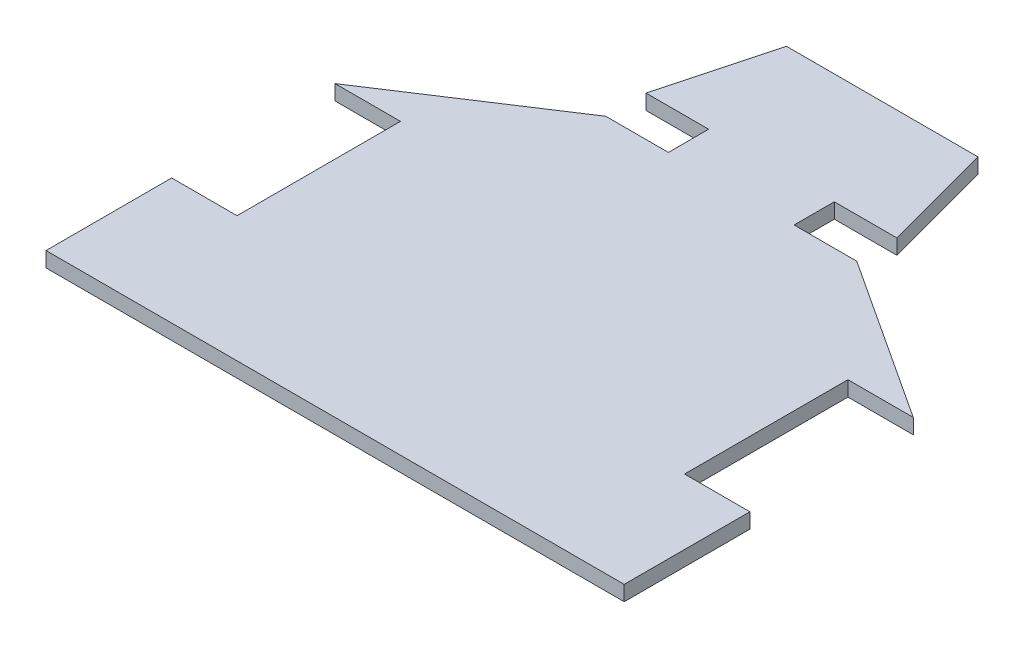
ISO-10303-21;
HEADER;
FILE_DESCRIPTION(('STEP AP214'),'2;1');
FILE_NAME('part.step','',(''),(''),'','','');
FILE_SCHEMA(('AUTOMOTIVE_DESIGN { 1 0 10303 214 1 1 1 1 }'));
ENDSEC;
DATA;
#1=APPLICATION_CONTEXT('core data for automotive mechanical design processes');
#2=APPLICATION_PROTOCOL_DEFINITION('international standard','automotive_design',2000,#1);
#3=PRODUCT_CONTEXT('',#1,'mechanical');
#4=PRODUCT('Part','Part','',(#3));
#5=PRODUCT_RELATED_PRODUCT_CATEGORY('part','',(#4));
#6=PRODUCT_DEFINITION_FORMATION('','',#4);
#7=PRODUCT_DEFINITION_CONTEXT('part definition',#1,'design');
#8=PRODUCT_DEFINITION('design','',#6,#7);
#9=PRODUCT_DEFINITION_SHAPE('','',#8);
#10=(LENGTH_UNIT() NAMED_UNIT(*) SI_UNIT(.MILLI.,.METRE.));
#11=(NAMED_UNIT(*) PLANE_ANGLE_UNIT() SI_UNIT($,.RADIAN.));
#12=(NAMED_UNIT(*) SI_UNIT($,.STERADIAN.) SOLID_ANGLE_UNIT());
#13=UNCERTAINTY_MEASURE_WITH_UNIT(LENGTH_MEASURE(1.E-05),#10,'distance_accuracy_value','');
#14=(GEOMETRIC_REPRESENTATION_CONTEXT(3) GLOBAL_UNCERTAINTY_ASSIGNED_CONTEXT((#13)) GLOBAL_UNIT_ASSIGNED_CONTEXT((#10,
#11,#12)) REPRESENTATION_CONTEXT('',''));
#15=CARTESIAN_POINT('',(0.,0.,0.));
#16=DIRECTION('',(0.,0.,1.));
#17=DIRECTION('',(1.,0.,0.));
#18=AXIS2_PLACEMENT_3D('',#15,#16,#17);
#19=CARTESIAN_POINT('',(-115.,6.,0.));
#20=DIRECTION('',(1.,0.,0.));
#21=DIRECTION('',(0.,0.,-1.));
#22=AXIS2_PLACEMENT_3D('',#19,#20,#21);
#23=PLANE('',#22);
#24=DIRECTION('',(0.,0.,1.));
#25=VECTOR('',#24,1.);
#26=CARTESIAN_POINT('',(-115.,0.,0.));
#27=LINE('',#26,#25);
#28=CARTESIAN_POINT('',(-115.,0.,-50.));
#29=VERTEX_POINT('',#28);
#30=CARTESIAN_POINT('',(-115.,0.,0.));
#31=VERTEX_POINT('',#30);
#32=EDGE_CURVE('E204',#29,#31,#27,.T.);
#33=ORIENTED_EDGE('',*,*,#32,.T.);
#34=DIRECTION('',(0.,-1.,0.));
#35=VECTOR('',#34,1.);
#36=CARTESIAN_POINT('',(-115.,6.,0.));
#37=LINE('',#36,#35);
#38=CARTESIAN_POINT('',(-115.,6.,0.));
#39=VERTEX_POINT('',#38);
#40=EDGE_CURVE('E11',#39,#31,#37,.T.);
#41=ORIENTED_EDGE('',*,*,#40,.F.);
#42=DIRECTION('',(0.,0.,1.));
#43=VECTOR('',#42,1.);
#44=CARTESIAN_POINT('',(-115.,6.,0.));
#45=LINE('',#44,#43);
#46=CARTESIAN_POINT('',(-115.,6.,-50.));
#47=VERTEX_POINT('',#46);
#48=EDGE_CURVE('E242',#47,#39,#45,.T.);
#49=ORIENTED_EDGE('',*,*,#48,.F.);
#50=DIRECTION('',(0.,-1.,0.));
#51=VECTOR('',#50,1.);
#52=CARTESIAN_POINT('',(-115.,6.,-50.));
#53=LINE('',#52,#51);
#54=EDGE_CURVE('E200',#47,#29,#53,.T.);
#55=ORIENTED_EDGE('',*,*,#54,.T.);
#56=EDGE_LOOP('',(#33,#41,#49,#55));
#57=FACE_BOUND('',#56,.T.);
#58=ADVANCED_FACE('F36',(#57),#23,.F.);
#59=CARTESIAN_POINT('',(-115.,6.,0.));
#60=DIRECTION('',(0.,0.,-1.));
#61=DIRECTION('',(-1.,0.,0.));
#62=AXIS2_PLACEMENT_3D('',#59,#60,#61);
#63=PLANE('',#62);
#64=DIRECTION('',(1.,0.,0.));
#65=VECTOR('',#64,1.);
#66=CARTESIAN_POINT('',(-115.,0.,0.));
#67=LINE('',#66,#65);
#68=CARTESIAN_POINT('',(115.,0.,0.));
#69=VERTEX_POINT('',#68);
#70=EDGE_CURVE('E207',#31,#69,#67,.T.);
#71=ORIENTED_EDGE('',*,*,#70,.T.);
#72=DIRECTION('',(0.,-1.,0.));
#73=VECTOR('',#72,1.);
#74=CARTESIAN_POINT('',(115.,6.,0.));
#75=LINE('',#74,#73);
#76=CARTESIAN_POINT('',(115.,6.,0.));
#77=VERTEX_POINT('',#76);
#78=EDGE_CURVE('E44',#77,#69,#75,.T.);
#79=ORIENTED_EDGE('',*,*,#78,.F.);
#80=DIRECTION('',(1.,0.,0.));
#81=VECTOR('',#80,1.);
#82=CARTESIAN_POINT('',(-115.,6.,0.));
#83=LINE('',#82,#81);
#84=EDGE_CURVE('E131',#39,#77,#83,.T.);
#85=ORIENTED_EDGE('',*,*,#84,.F.);
#86=ORIENTED_EDGE('',*,*,#40,.T.);
#87=EDGE_LOOP('',(#71,#79,#85,#86));
#88=FACE_BOUND('',#87,.T.);
#89=ADVANCED_FACE('F360',(#88),#63,.F.);
#90=CARTESIAN_POINT('',(115.,6.,0.));
#91=DIRECTION('',(-1.,0.,0.));
#92=DIRECTION('',(0.,0.,1.));
#93=AXIS2_PLACEMENT_3D('',#90,#91,#92);
#94=PLANE('',#93);
#95=DIRECTION('',(0.,0.,-1.));
#96=VECTOR('',#95,1.);
#97=CARTESIAN_POINT('',(115.,0.,0.));
#98=LINE('',#97,#96);
#99=CARTESIAN_POINT('',(115.,0.,-50.));
#100=VERTEX_POINT('',#99);
#101=EDGE_CURVE('E209',#69,#100,#98,.T.);
#102=ORIENTED_EDGE('',*,*,#101,.T.);
#103=DIRECTION('',(0.,-1.,0.));
#104=VECTOR('',#103,1.);
#105=CARTESIAN_POINT('',(115.,6.,-50.));
#106=LINE('',#105,#104);
#107=CARTESIAN_POINT('',(115.,6.,-50.));
#108=VERTEX_POINT('',#107);
#109=EDGE_CURVE('E285',#108,#100,#106,.T.);
#110=ORIENTED_EDGE('',*,*,#109,.F.);
#111=DIRECTION('',(0.,0.,-1.));
#112=VECTOR('',#111,1.);
#113=CARTESIAN_POINT('',(115.,6.,0.));
#114=LINE('',#113,#112);
#115=EDGE_CURVE('E293',#77,#108,#114,.T.);
#116=ORIENTED_EDGE('',*,*,#115,.F.);
#117=ORIENTED_EDGE('',*,*,#78,.T.);
#118=EDGE_LOOP('',(#102,#110,#116,#117));
#119=FACE_BOUND('',#118,.T.);
#120=ADVANCED_FACE('F291',(#119),#94,.F.);
#121=CARTESIAN_POINT('',(115.,6.,-50.));
#122=DIRECTION('',(0.,0.,1.));
#123=DIRECTION('',(1.,0.,0.));
#124=AXIS2_PLACEMENT_3D('',#121,#122,#123);
#125=PLANE('',#124);
#126=DIRECTION('',(-1.,0.,0.));
#127=VECTOR('',#126,1.);
#128=CARTESIAN_POINT('',(115.,0.,-50.));
#129=LINE('',#128,#127);
#130=CARTESIAN_POINT('',(89.,0.,-50.));
#131=VERTEX_POINT('',#130);
#132=EDGE_CURVE('E211',#100,#131,#129,.T.);
#133=ORIENTED_EDGE('',*,*,#132,.T.);
#134=DIRECTION('',(0.,-1.,0.));
#135=VECTOR('',#134,1.);
#136=CARTESIAN_POINT('',(89.,6.,-50.));
#137=LINE('',#136,#135);
#138=CARTESIAN_POINT('',(89.,6.,-50.));
#139=VERTEX_POINT('',#138);
#140=EDGE_CURVE('E282',#139,#131,#137,.T.);
#141=ORIENTED_EDGE('',*,*,#140,.F.);
#142=DIRECTION('',(-1.,0.,0.));
#143=VECTOR('',#142,1.);
#144=CARTESIAN_POINT('',(115.,6.,-50.));
#145=LINE('',#144,#143);
#146=EDGE_CURVE('E311',#108,#139,#145,.T.);
#147=ORIENTED_EDGE('',*,*,#146,.F.);
#148=ORIENTED_EDGE('',*,*,#109,.T.);
#149=EDGE_LOOP('',(#133,#141,#147,#148));
#150=FACE_BOUND('',#149,.T.);
#151=ADVANCED_FACE('F302',(#150),#125,.F.);
#152=CARTESIAN_POINT('',(89.,6.,-50.));
#153=DIRECTION('',(-1.,0.,0.));
#154=DIRECTION('',(0.,0.,1.));
#155=AXIS2_PLACEMENT_3D('',#152,#153,#154);
#156=PLANE('',#155);
#157=DIRECTION('',(0.,0.,-1.));
#158=VECTOR('',#157,1.);
#159=CARTESIAN_POINT('',(89.,0.,-50.));
#160=LINE('',#159,#158);
#161=CARTESIAN_POINT('',(89.,0.,-115.));
#162=VERTEX_POINT('',#161);
#163=EDGE_CURVE('E213',#131,#162,#160,.T.);
#164=ORIENTED_EDGE('',*,*,#163,.T.);
#165=DIRECTION('',(0.,-1.,0.));
#166=VECTOR('',#165,1.);
#167=CARTESIAN_POINT('',(89.,6.,-115.));
#168=LINE('',#167,#166);
#169=CARTESIAN_POINT('',(89.,6.,-115.));
#170=VERTEX_POINT('',#169);
#171=EDGE_CURVE('E279',#170,#162,#168,.T.);
#172=ORIENTED_EDGE('',*,*,#171,.F.);
#173=DIRECTION('',(0.,0.,-1.));
#174=VECTOR('',#173,1.);
#175=CARTESIAN_POINT('',(89.,6.,-50.));
#176=LINE('',#175,#174);
#177=EDGE_CURVE('E308',#139,#170,#176,.T.);
#178=ORIENTED_EDGE('',*,*,#177,.F.);
#179=ORIENTED_EDGE('',*,*,#140,.T.);
#180=EDGE_LOOP('',(#164,#172,#178,#179));
#181=FACE_BOUND('',#180,.T.);
#182=ADVANCED_FACE('F306',(#181),#156,.F.);
#183=CARTESIAN_POINT('',(89.,6.,-115.));
#184=DIRECTION('',(0.,0.,-1.));
#185=DIRECTION('',(-1.,0.,0.));
#186=AXIS2_PLACEMENT_3D('',#183,#184,#185);
#187=PLANE('',#186);
#188=DIRECTION('',(1.,0.,0.));
#189=VECTOR('',#188,1.);
#190=CARTESIAN_POINT('',(89.,0.,-115.));
#191=LINE('',#190,#189);
#192=CARTESIAN_POINT('',(115.,0.,-115.));
#193=VERTEX_POINT('',#192);
#194=EDGE_CURVE('E215',#162,#193,#191,.T.);
#195=ORIENTED_EDGE('',*,*,#194,.T.);
#196=DIRECTION('',(0.,-1.,0.));
#197=VECTOR('',#196,1.);
#198=CARTESIAN_POINT('',(115.,6.,-115.));
#199=LINE('',#198,#197);
#200=CARTESIAN_POINT('',(115.,6.,-115.));
#201=VERTEX_POINT('',#200);
#202=EDGE_CURVE('E276',#201,#193,#199,.T.);
#203=ORIENTED_EDGE('',*,*,#202,.F.);
#204=DIRECTION('',(1.,0.,0.));
#205=VECTOR('',#204,1.);
#206=CARTESIAN_POINT('',(89.,6.,-115.));
#207=LINE('',#206,#205);
#208=EDGE_CURVE('E310',#170,#201,#207,.T.);
#209=ORIENTED_EDGE('',*,*,#208,.F.);
#210=ORIENTED_EDGE('',*,*,#171,.T.);
#211=EDGE_LOOP('',(#195,#203,#209,#210));
#212=FACE_BOUND('',#211,.T.);
#213=ADVANCED_FACE('F373',(#212),#187,.F.);
#214=CARTESIAN_POINT('',(115.,6.,-115.));
#215=DIRECTION('',(-0.547577150009038,0.,0.836755200036414));
#216=DIRECTION('',(0.836755200036414,0.,0.547577150009038));
#217=AXIS2_PLACEMENT_3D('',#214,#215,#216);
#218=PLANE('',#217);
#219=DIRECTION('',(-0.836755200036414,0.,-0.547577150009038));
#220=VECTOR('',#219,1.);
#221=CARTESIAN_POINT('',(115.,0.,-115.));
#222=LINE('',#221,#220);
#223=CARTESIAN_POINT('',(49.9280118544458,0.,-157.583462657434));
#224=VERTEX_POINT('',#223);
#225=EDGE_CURVE('E217',#193,#224,#222,.T.);
#226=ORIENTED_EDGE('',*,*,#225,.T.);
#227=DIRECTION('',(0.,-1.,0.));
#228=VECTOR('',#227,1.);
#229=CARTESIAN_POINT('',(49.9280118544458,6.,-157.583462657434));
#230=LINE('',#229,#228);
#231=CARTESIAN_POINT('',(49.9280118544458,6.,-157.583462657434));
#232=VERTEX_POINT('',#231);
#233=EDGE_CURVE('E273',#232,#224,#230,.T.);
#234=ORIENTED_EDGE('',*,*,#233,.F.);
#235=DIRECTION('',(-0.836755200036414,0.,-0.547577150009038));
#236=VECTOR('',#235,1.);
#237=CARTESIAN_POINT('',(115.,6.,-115.));
#238=LINE('',#237,#236);
#239=EDGE_CURVE('E313',#201,#232,#238,.T.);
#240=ORIENTED_EDGE('',*,*,#239,.F.);
#241=ORIENTED_EDGE('',*,*,#202,.T.);
#242=EDGE_LOOP('',(#226,#234,#240,#241));
#243=FACE_BOUND('',#242,.T.);
#244=ADVANCED_FACE('F376',(#243),#218,.F.);
#245=CARTESIAN_POINT('',(49.9280118544458,6.,-157.583462657434));
#246=DIRECTION('',(0.,0.,1.));
#247=DIRECTION('',(1.,0.,0.));
#248=AXIS2_PLACEMENT_3D('',#245,#246,#247);
#249=PLANE('',#248);
#250=DIRECTION('',(-1.,0.,0.));
#251=VECTOR('',#250,1.);
#252=CARTESIAN_POINT('',(49.9280118544458,0.,-157.583462657434));
#253=LINE('',#252,#251);
#254=CARTESIAN_POINT('',(25.,0.,-157.583462657434));
#255=VERTEX_POINT('',#254);
#256=EDGE_CURVE('E219',#224,#255,#253,.T.);
#257=ORIENTED_EDGE('',*,*,#256,.T.);
#258=DIRECTION('',(0.,-1.,0.));
#259=VECTOR('',#258,1.);
#260=CARTESIAN_POINT('',(25.,6.,-157.583462657434));
#261=LINE('',#260,#259);
#262=CARTESIAN_POINT('',(25.,6.,-157.583462657434));
#263=VERTEX_POINT('',#262);
#264=EDGE_CURVE('E270',#263,#255,#261,.T.);
#265=ORIENTED_EDGE('',*,*,#264,.F.);
#266=DIRECTION('',(-1.,0.,0.));
#267=VECTOR('',#266,1.);
#268=CARTESIAN_POINT('',(49.9280118544458,6.,-157.583462657434));
#269=LINE('',#268,#267);
#270=EDGE_CURVE('E319',#232,#263,#269,.T.);
#271=ORIENTED_EDGE('',*,*,#270,.F.);
#272=ORIENTED_EDGE('',*,*,#233,.T.);
#273=EDGE_LOOP('',(#257,#265,#271,#272));
#274=FACE_BOUND('',#273,.T.);
#275=ADVANCED_FACE('F380',(#274),#249,.F.);
#276=CARTESIAN_POINT('',(25.,6.,-157.583462657434));
#277=DIRECTION('',(-1.,0.,0.));
#278=DIRECTION('',(0.,0.,1.));
#279=AXIS2_PLACEMENT_3D('',#276,#277,#278);
#280=PLANE('',#279);
#281=DIRECTION('',(0.,0.,-1.));
#282=VECTOR('',#281,1.);
#283=CARTESIAN_POINT('',(25.,0.,-157.583462657434));
#284=LINE('',#283,#282);
#285=CARTESIAN_POINT('',(25.,0.,-173.583462657434));
#286=VERTEX_POINT('',#285);
#287=EDGE_CURVE('E221',#255,#286,#284,.T.);
#288=ORIENTED_EDGE('',*,*,#287,.T.);
#289=DIRECTION('',(0.,-1.,0.));
#290=VECTOR('',#289,1.);
#291=CARTESIAN_POINT('',(25.,6.,-173.583462657434));
#292=LINE('',#291,#290);
#293=CARTESIAN_POINT('',(25.,6.,-173.583462657434));
#294=VERTEX_POINT('',#293);
#295=EDGE_CURVE('E267',#294,#286,#292,.T.);
#296=ORIENTED_EDGE('',*,*,#295,.F.);
#297=DIRECTION('',(0.,0.,-1.));
#298=VECTOR('',#297,1.);
#299=CARTESIAN_POINT('',(25.,6.,-157.583462657434));
#300=LINE('',#299,#298);
#301=EDGE_CURVE('E321',#263,#294,#300,.T.);
#302=ORIENTED_EDGE('',*,*,#301,.F.);
#303=ORIENTED_EDGE('',*,*,#264,.T.);
#304=EDGE_LOOP('',(#288,#296,#302,#303));
#305=FACE_BOUND('',#304,.T.);
#306=ADVANCED_FACE('F384',(#305),#280,.F.);
#307=CARTESIAN_POINT('',(25.,6.,-173.583462657434));
#308=DIRECTION('',(0.,0.,-1.));
#309=DIRECTION('',(-1.,0.,0.));
#310=AXIS2_PLACEMENT_3D('',#307,#308,#309);
#311=PLANE('',#310);
#312=DIRECTION('',(1.,0.,0.));
#313=VECTOR('',#312,1.);
#314=CARTESIAN_POINT('',(25.,0.,-173.583462657434));
#315=LINE('',#314,#313);
#316=CARTESIAN_POINT('',(49.9280118544458,0.,-173.583462657434));
#317=VERTEX_POINT('',#316);
#318=EDGE_CURVE('E223',#286,#317,#315,.T.);
#319=ORIENTED_EDGE('',*,*,#318,.T.);
#320=DIRECTION('',(0.,-1.,0.));
#321=VECTOR('',#320,1.);
#322=CARTESIAN_POINT('',(49.9280118544458,6.,-173.583462657434));
#323=LINE('',#322,#321);
#324=CARTESIAN_POINT('',(49.9280118544458,6.,-173.583462657434));
#325=VERTEX_POINT('',#324);
#326=EDGE_CURVE('E264',#325,#317,#323,.T.);
#327=ORIENTED_EDGE('',*,*,#326,.F.);
#328=DIRECTION('',(1.,0.,0.));
#329=VECTOR('',#328,1.);
#330=CARTESIAN_POINT('',(25.,6.,-173.583462657434));
#331=LINE('',#330,#329);
#332=EDGE_CURVE('E323',#294,#325,#331,.T.);
#333=ORIENTED_EDGE('',*,*,#332,.F.);
#334=ORIENTED_EDGE('',*,*,#295,.T.);
#335=EDGE_LOOP('',(#319,#327,#333,#334));
#336=FACE_BOUND('',#335,.T.);
#337=ADVANCED_FACE('F388',(#336),#311,.F.);
#338=CARTESIAN_POINT('',(49.9280118544458,6.,-173.583462657434));
#339=DIRECTION('',(-0.965834093442506,0.,0.259161154388717));
#340=DIRECTION('',(0.259161154388717,0.,0.965834093442506));
#341=AXIS2_PLACEMENT_3D('',#338,#339,#340);
#342=PLANE('',#341);
#343=DIRECTION('',(-0.259161154388717,0.,-0.965834093442506));
#344=VECTOR('',#343,1.);
#345=CARTESIAN_POINT('',(49.9280118544458,0.,-173.583462657434));
#346=LINE('',#345,#344);
#347=CARTESIAN_POINT('',(38.1086453996228,0.,-217.63152654218));
#348=VERTEX_POINT('',#347);
#349=EDGE_CURVE('E225',#317,#348,#346,.T.);
#350=ORIENTED_EDGE('',*,*,#349,.T.);
#351=DIRECTION('',(0.,-1.,0.));
#352=VECTOR('',#351,1.);
#353=CARTESIAN_POINT('',(38.1086453996228,6.,-217.63152654218));
#354=LINE('',#353,#352);
#355=CARTESIAN_POINT('',(38.1086453996228,6.,-217.63152654218));
#356=VERTEX_POINT('',#355);
#357=EDGE_CURVE('E261',#356,#348,#354,.T.);
#358=ORIENTED_EDGE('',*,*,#357,.F.);
#359=DIRECTION('',(-0.259161154388717,0.,-0.965834093442506));
#360=VECTOR('',#359,1.);
#361=CARTESIAN_POINT('',(49.9280118544458,6.,-173.583462657434));
#362=LINE('',#361,#360);
#363=EDGE_CURVE('E325',#325,#356,#362,.T.);
#364=ORIENTED_EDGE('',*,*,#363,.F.);
#365=ORIENTED_EDGE('',*,*,#326,.T.);
#366=EDGE_LOOP('',(#350,#358,#364,#365));
#367=FACE_BOUND('',#366,.T.);
#368=ADVANCED_FACE('F392',(#367),#342,.F.);
#369=CARTESIAN_POINT('',(-38.1086453996228,6.,-217.63152654218));
#370=DIRECTION('',(0.,0.,1.));
#371=DIRECTION('',(1.,0.,0.));
#372=AXIS2_PLACEMENT_3D('',#369,#370,#371);
#373=PLANE('',#372);
#374=DIRECTION('',(-1.,0.,0.));
#375=VECTOR('',#374,1.);
#376=CARTESIAN_POINT('',(-38.1086453996228,0.,-217.63152654218));
#377=LINE('',#376,#375);
#378=CARTESIAN_POINT('',(-38.1086453996228,0.,-217.63152654218));
#379=VERTEX_POINT('',#378);
#380=EDGE_CURVE('E227',#348,#379,#377,.T.);
#381=ORIENTED_EDGE('',*,*,#380,.T.);
#382=DIRECTION('',(0.,-1.,0.));
#383=VECTOR('',#382,1.);
#384=CARTESIAN_POINT('',(-38.1086453996228,6.,-217.63152654218));
#385=LINE('',#384,#383);
#386=CARTESIAN_POINT('',(-38.1086453996228,6.,-217.63152654218));
#387=VERTEX_POINT('',#386);
#388=EDGE_CURVE('E258',#387,#379,#385,.T.);
#389=ORIENTED_EDGE('',*,*,#388,.F.);
#390=DIRECTION('',(-1.,0.,0.));
#391=VECTOR('',#390,1.);
#392=CARTESIAN_POINT('',(-38.1086453996228,6.,-217.63152654218));
#393=LINE('',#392,#391);
#394=EDGE_CURVE('E327',#356,#387,#393,.T.);
#395=ORIENTED_EDGE('',*,*,#394,.F.);
#396=ORIENTED_EDGE('',*,*,#357,.T.);
#397=EDGE_LOOP('',(#381,#389,#395,#396));
#398=FACE_BOUND('',#397,.T.);
#399=ADVANCED_FACE('F396',(#398),#373,.F.);
#400=CARTESIAN_POINT('',(-49.9280118544458,6.,-173.583462657434));
#401=DIRECTION('',(0.965834093442506,0.,0.259161154388717));
#402=DIRECTION('',(0.259161154388717,0.,-0.965834093442506));
#403=AXIS2_PLACEMENT_3D('',#400,#401,#402);
#404=PLANE('',#403);
#405=DIRECTION('',(-0.259161154388717,0.,0.965834093442506));
#406=VECTOR('',#405,1.);
#407=CARTESIAN_POINT('',(-49.9280118544458,0.,-173.583462657434));
#408=LINE('',#407,#406);
#409=CARTESIAN_POINT('',(-49.9280118544458,0.,-173.583462657434));
#410=VERTEX_POINT('',#409);
#411=EDGE_CURVE('E229',#379,#410,#408,.T.);
#412=ORIENTED_EDGE('',*,*,#411,.T.);
#413=DIRECTION('',(0.,-1.,0.));
#414=VECTOR('',#413,1.);
#415=CARTESIAN_POINT('',(-49.9280118544458,6.,-173.583462657434));
#416=LINE('',#415,#414);
#417=CARTESIAN_POINT('',(-49.9280118544458,6.,-173.583462657434));
#418=VERTEX_POINT('',#417);
#419=EDGE_CURVE('E255',#418,#410,#416,.T.);
#420=ORIENTED_EDGE('',*,*,#419,.F.);
#421=DIRECTION('',(-0.259161154388717,0.,0.965834093442506));
#422=VECTOR('',#421,1.);
#423=CARTESIAN_POINT('',(-49.9280118544458,6.,-173.583462657434));
#424=LINE('',#423,#422);
#425=EDGE_CURVE('E329',#387,#418,#424,.T.);
#426=ORIENTED_EDGE('',*,*,#425,.F.);
#427=ORIENTED_EDGE('',*,*,#388,.T.);
#428=EDGE_LOOP('',(#412,#420,#426,#427));
#429=FACE_BOUND('',#428,.T.);
#430=ADVANCED_FACE('F400',(#429),#404,.F.);
#431=CARTESIAN_POINT('',(-25.,6.,-173.583462657434));
#432=DIRECTION('',(0.,0.,-1.));
#433=DIRECTION('',(-1.,0.,0.));
#434=AXIS2_PLACEMENT_3D('',#431,#432,#433);
#435=PLANE('',#434);
#436=DIRECTION('',(1.,0.,0.));
#437=VECTOR('',#436,1.);
#438=CARTESIAN_POINT('',(-25.,0.,-173.583462657434));
#439=LINE('',#438,#437);
#440=CARTESIAN_POINT('',(-25.,0.,-173.583462657434));
#441=VERTEX_POINT('',#440);
#442=EDGE_CURVE('E231',#410,#441,#439,.T.);
#443=ORIENTED_EDGE('',*,*,#442,.T.);
#444=DIRECTION('',(0.,-1.,0.));
#445=VECTOR('',#444,1.);
#446=CARTESIAN_POINT('',(-25.,6.,-173.583462657434));
#447=LINE('',#446,#445);
#448=CARTESIAN_POINT('',(-25.,6.,-173.583462657434));
#449=VERTEX_POINT('',#448);
#450=EDGE_CURVE('E252',#449,#441,#447,.T.);
#451=ORIENTED_EDGE('',*,*,#450,.F.);
#452=DIRECTION('',(1.,0.,0.));
#453=VECTOR('',#452,1.);
#454=CARTESIAN_POINT('',(-25.,6.,-173.583462657434));
#455=LINE('',#454,#453);
#456=EDGE_CURVE('E331',#418,#449,#455,.T.);
#457=ORIENTED_EDGE('',*,*,#456,.F.);
#458=ORIENTED_EDGE('',*,*,#419,.T.);
#459=EDGE_LOOP('',(#443,#451,#457,#458));
#460=FACE_BOUND('',#459,.T.);
#461=ADVANCED_FACE('F404',(#460),#435,.F.);
#462=CARTESIAN_POINT('',(-25.,6.,-157.583462657434));
#463=DIRECTION('',(1.,0.,0.));
#464=DIRECTION('',(0.,0.,-1.));
#465=AXIS2_PLACEMENT_3D('',#462,#463,#464);
#466=PLANE('',#465);
#467=DIRECTION('',(0.,0.,1.));
#468=VECTOR('',#467,1.);
#469=CARTESIAN_POINT('',(-25.,0.,-157.583462657434));
#470=LINE('',#469,#468);
#471=CARTESIAN_POINT('',(-25.,0.,-157.583462657434));
#472=VERTEX_POINT('',#471);
#473=EDGE_CURVE('E233',#441,#472,#470,.T.);
#474=ORIENTED_EDGE('',*,*,#473,.T.);
#475=DIRECTION('',(0.,-1.,0.));
#476=VECTOR('',#475,1.);
#477=CARTESIAN_POINT('',(-25.,6.,-157.583462657434));
#478=LINE('',#477,#476);
#479=CARTESIAN_POINT('',(-25.,6.,-157.583462657434));
#480=VERTEX_POINT('',#479);
#481=EDGE_CURVE('E249',#480,#472,#478,.T.);
#482=ORIENTED_EDGE('',*,*,#481,.F.);
#483=DIRECTION('',(0.,0.,1.));
#484=VECTOR('',#483,1.);
#485=CARTESIAN_POINT('',(-25.,6.,-157.583462657434));
#486=LINE('',#485,#484);
#487=EDGE_CURVE('E333',#449,#480,#486,.T.);
#488=ORIENTED_EDGE('',*,*,#487,.F.);
#489=ORIENTED_EDGE('',*,*,#450,.T.);
#490=EDGE_LOOP('',(#474,#482,#488,#489));
#491=FACE_BOUND('',#490,.T.);
#492=ADVANCED_FACE('F408',(#491),#466,.F.);
#493=CARTESIAN_POINT('',(-49.9280118544458,6.,-157.583462657434));
#494=DIRECTION('',(0.,0.,1.));
#495=DIRECTION('',(1.,0.,0.));
#496=AXIS2_PLACEMENT_3D('',#493,#494,#495);
#497=PLANE('',#496);
#498=DIRECTION('',(-1.,0.,0.));
#499=VECTOR('',#498,1.);
#500=CARTESIAN_POINT('',(-49.9280118544458,0.,-157.583462657434));
#501=LINE('',#500,#499);
#502=CARTESIAN_POINT('',(-49.9280118544458,0.,-157.583462657434));
#503=VERTEX_POINT('',#502);
#504=EDGE_CURVE('E235',#472,#503,#501,.T.);
#505=ORIENTED_EDGE('',*,*,#504,.T.);
#506=DIRECTION('',(0.,-1.,0.));
#507=VECTOR('',#506,1.);
#508=CARTESIAN_POINT('',(-49.9280118544458,6.,-157.583462657434));
#509=LINE('',#508,#507);
#510=CARTESIAN_POINT('',(-49.9280118544458,6.,-157.583462657434));
#511=VERTEX_POINT('',#510);
#512=EDGE_CURVE('E246',#511,#503,#509,.T.);
#513=ORIENTED_EDGE('',*,*,#512,.F.);
#514=DIRECTION('',(-1.,0.,0.));
#515=VECTOR('',#514,1.);
#516=CARTESIAN_POINT('',(-49.9280118544458,6.,-157.583462657434));
#517=LINE('',#516,#515);
#518=EDGE_CURVE('E335',#480,#511,#517,.T.);
#519=ORIENTED_EDGE('',*,*,#518,.F.);
#520=ORIENTED_EDGE('',*,*,#481,.T.);
#521=EDGE_LOOP('',(#505,#513,#519,#520));
#522=FACE_BOUND('',#521,.T.);
#523=ADVANCED_FACE('F341',(#522),#497,.F.);
#524=CARTESIAN_POINT('',(-115.,6.,-115.));
#525=DIRECTION('',(0.547577150009038,0.,0.836755200036414));
#526=DIRECTION('',(0.836755200036414,0.,-0.547577150009038));
#527=AXIS2_PLACEMENT_3D('',#524,#525,#526);
#528=PLANE('',#527);
#529=DIRECTION('',(-0.836755200036414,0.,0.547577150009038));
#530=VECTOR('',#529,1.);
#531=CARTESIAN_POINT('',(-115.,0.,-115.));
#532=LINE('',#531,#530);
#533=CARTESIAN_POINT('',(-115.,0.,-115.));
#534=VERTEX_POINT('',#533);
#535=EDGE_CURVE('E237',#503,#534,#532,.T.);
#536=ORIENTED_EDGE('',*,*,#535,.T.);
#537=DIRECTION('',(0.,-1.,0.));
#538=VECTOR('',#537,1.);
#539=CARTESIAN_POINT('',(-115.,6.,-115.));
#540=LINE('',#539,#538);
#541=CARTESIAN_POINT('',(-115.,6.,-115.));
#542=VERTEX_POINT('',#541);
#543=EDGE_CURVE('E195',#542,#534,#540,.T.);
#544=ORIENTED_EDGE('',*,*,#543,.F.);
#545=DIRECTION('',(-0.836755200036414,0.,0.547577150009038));
#546=VECTOR('',#545,1.);
#547=CARTESIAN_POINT('',(-115.,6.,-115.));
#548=LINE('',#547,#546);
#549=EDGE_CURVE('E186',#511,#542,#548,.T.);
#550=ORIENTED_EDGE('',*,*,#549,.F.);
#551=ORIENTED_EDGE('',*,*,#512,.T.);
#552=EDGE_LOOP('',(#536,#544,#550,#551));
#553=FACE_BOUND('',#552,.T.);
#554=ADVANCED_FACE('F345',(#553),#528,.F.);
#555=CARTESIAN_POINT('',(-89.,6.,-115.));
#556=DIRECTION('',(0.,0.,-1.));
#557=DIRECTION('',(-1.,0.,0.));
#558=AXIS2_PLACEMENT_3D('',#555,#556,#557);
#559=PLANE('',#558);
#560=DIRECTION('',(1.,0.,0.));
#561=VECTOR('',#560,1.);
#562=CARTESIAN_POINT('',(-89.,0.,-115.));
#563=LINE('',#562,#561);
#564=CARTESIAN_POINT('',(-89.,0.,-115.));
#565=VERTEX_POINT('',#564);
#566=EDGE_CURVE('E194',#534,#565,#563,.T.);
#567=ORIENTED_EDGE('',*,*,#566,.T.);
#568=DIRECTION('',(0.,-1.,0.));
#569=VECTOR('',#568,1.);
#570=CARTESIAN_POINT('',(-89.,6.,-115.));
#571=LINE('',#570,#569);
#572=CARTESIAN_POINT('',(-89.,6.,-115.));
#573=VERTEX_POINT('',#572);
#574=EDGE_CURVE('E191',#573,#565,#571,.T.);
#575=ORIENTED_EDGE('',*,*,#574,.F.);
#576=DIRECTION('',(1.,0.,0.));
#577=VECTOR('',#576,1.);
#578=CARTESIAN_POINT('',(-89.,6.,-115.));
#579=LINE('',#578,#577);
#580=EDGE_CURVE('E180',#542,#573,#579,.T.);
#581=ORIENTED_EDGE('',*,*,#580,.F.);
#582=ORIENTED_EDGE('',*,*,#543,.T.);
#583=EDGE_LOOP('',(#567,#575,#581,#582));
#584=FACE_BOUND('',#583,.T.);
#585=ADVANCED_FACE('F192',(#584),#559,.F.);
#586=CARTESIAN_POINT('',(-89.,6.,-50.));
#587=DIRECTION('',(1.,0.,0.));
#588=DIRECTION('',(0.,0.,-1.));
#589=AXIS2_PLACEMENT_3D('',#586,#587,#588);
#590=PLANE('',#589);
#591=DIRECTION('',(0.,0.,1.));
#592=VECTOR('',#591,1.);
#593=CARTESIAN_POINT('',(-89.,0.,-50.));
#594=LINE('',#593,#592);
#595=CARTESIAN_POINT('',(-89.,0.,-50.));
#596=VERTEX_POINT('',#595);
#597=EDGE_CURVE('E117',#565,#596,#594,.T.);
#598=ORIENTED_EDGE('',*,*,#597,.T.);
#599=DIRECTION('',(0.,-1.,0.));
#600=VECTOR('',#599,1.);
#601=CARTESIAN_POINT('',(-89.,6.,-50.));
#602=LINE('',#601,#600);
#603=CARTESIAN_POINT('',(-89.,6.,-50.));
#604=VERTEX_POINT('',#603);
#605=EDGE_CURVE('E196',#604,#596,#602,.T.);
#606=ORIENTED_EDGE('',*,*,#605,.F.);
#607=DIRECTION('',(0.,0.,1.));
#608=VECTOR('',#607,1.);
#609=CARTESIAN_POINT('',(-89.,6.,-50.));
#610=LINE('',#609,#608);
#611=EDGE_CURVE('E184',#573,#604,#610,.T.);
#612=ORIENTED_EDGE('',*,*,#611,.F.);
#613=ORIENTED_EDGE('',*,*,#574,.T.);
#614=EDGE_LOOP('',(#598,#606,#612,#613));
#615=FACE_BOUND('',#614,.T.);
#616=ADVANCED_FACE('F198',(#615),#590,.F.);
#617=CARTESIAN_POINT('',(-115.,6.,-50.));
#618=DIRECTION('',(0.,0.,1.));
#619=DIRECTION('',(1.,0.,0.));
#620=AXIS2_PLACEMENT_3D('',#617,#618,#619);
#621=PLANE('',#620);
#622=DIRECTION('',(-1.,0.,0.));
#623=VECTOR('',#622,1.);
#624=CARTESIAN_POINT('',(-115.,0.,-50.));
#625=LINE('',#624,#623);
#626=EDGE_CURVE('E123',#596,#29,#625,.T.);
#627=ORIENTED_EDGE('',*,*,#626,.T.);
#628=ORIENTED_EDGE('',*,*,#54,.F.);
#629=DIRECTION('',(-1.,0.,0.));
#630=VECTOR('',#629,1.);
#631=CARTESIAN_POINT('',(-115.,6.,-50.));
#632=LINE('',#631,#630);
#633=EDGE_CURVE('E52',#604,#47,#632,.T.);
#634=ORIENTED_EDGE('',*,*,#633,.F.);
#635=ORIENTED_EDGE('',*,*,#605,.T.);
#636=EDGE_LOOP('',(#627,#628,#634,#635));
#637=FACE_BOUND('',#636,.T.);
#638=ADVANCED_FACE('F349',(#637),#621,.F.);
#639=CARTESIAN_POINT('',(0.,6.,0.));
#640=DIRECTION('',(0.,-1.,0.));
#641=DIRECTION('',(0.,0.,-1.));
#642=AXIS2_PLACEMENT_3D('',#639,#640,#641);
#643=PLANE('',#642);
#644=ORIENTED_EDGE('',*,*,#48,.T.);
#645=ORIENTED_EDGE('',*,*,#84,.T.);
#646=ORIENTED_EDGE('',*,*,#115,.T.);
#647=ORIENTED_EDGE('',*,*,#146,.T.);
#648=ORIENTED_EDGE('',*,*,#177,.T.);
#649=ORIENTED_EDGE('',*,*,#208,.T.);
#650=ORIENTED_EDGE('',*,*,#239,.T.);
#651=ORIENTED_EDGE('',*,*,#270,.T.);
#652=ORIENTED_EDGE('',*,*,#301,.T.);
#653=ORIENTED_EDGE('',*,*,#332,.T.);
#654=ORIENTED_EDGE('',*,*,#363,.T.);
#655=ORIENTED_EDGE('',*,*,#394,.T.);
#656=ORIENTED_EDGE('',*,*,#425,.T.);
#657=ORIENTED_EDGE('',*,*,#456,.T.);
#658=ORIENTED_EDGE('',*,*,#487,.T.);
#659=ORIENTED_EDGE('',*,*,#518,.T.);
#660=ORIENTED_EDGE('',*,*,#549,.T.);
#661=ORIENTED_EDGE('',*,*,#580,.T.);
#662=ORIENTED_EDGE('',*,*,#611,.T.);
#663=ORIENTED_EDGE('',*,*,#633,.T.);
#664=EDGE_LOOP('',(#644,#645,#646,#647,#648,#649,#650,#651,#652,#653,#654,#655,#656,#657,#658,
#659,#660,#661,#662,#663));
#665=FACE_BOUND('',#664,.T.);
#666=ADVANCED_FACE('F182',(#665),#643,.F.);
#667=CARTESIAN_POINT('',(0.,0.,0.));
#668=DIRECTION('',(0.,-1.,0.));
#669=DIRECTION('',(0.,0.,-1.));
#670=AXIS2_PLACEMENT_3D('',#667,#668,#669);
#671=PLANE('',#670);
#672=ORIENTED_EDGE('',*,*,#32,.F.);
#673=ORIENTED_EDGE('',*,*,#626,.F.);
#674=ORIENTED_EDGE('',*,*,#597,.F.);
#675=ORIENTED_EDGE('',*,*,#566,.F.);
#676=ORIENTED_EDGE('',*,*,#535,.F.);
#677=ORIENTED_EDGE('',*,*,#504,.F.);
#678=ORIENTED_EDGE('',*,*,#473,.F.);
#679=ORIENTED_EDGE('',*,*,#442,.F.);
#680=ORIENTED_EDGE('',*,*,#411,.F.);
#681=ORIENTED_EDGE('',*,*,#380,.F.);
#682=ORIENTED_EDGE('',*,*,#349,.F.);
#683=ORIENTED_EDGE('',*,*,#318,.F.);
#684=ORIENTED_EDGE('',*,*,#287,.F.);
#685=ORIENTED_EDGE('',*,*,#256,.F.);
#686=ORIENTED_EDGE('',*,*,#225,.F.);
#687=ORIENTED_EDGE('',*,*,#194,.F.);
#688=ORIENTED_EDGE('',*,*,#163,.F.);
#689=ORIENTED_EDGE('',*,*,#132,.F.);
#690=ORIENTED_EDGE('',*,*,#101,.F.);
#691=ORIENTED_EDGE('',*,*,#70,.F.);
#692=EDGE_LOOP('',(#672,#673,#674,#675,#676,#677,#678,#679,#680,#681,#682,#683,#684,#685,#686,
#687,#688,#689,#690,#691));
#693=FACE_BOUND('',#692,.T.);
#694=ADVANCED_FACE('F297',(#693),#671,.T.);
#695=CLOSED_SHELL('',(#58,#89,#120,#151,#182,#213,#244,#275,#306,#337,#368,#399,#430,#461,#492,
#523,#554,#585,#616,#638,#666,#694));
#696=MANIFOLD_SOLID_BREP('B2',#695);
#697=ADVANCED_BREP_SHAPE_REPRESENTATION('',(#18,#696),#14);
#698=SHAPE_DEFINITION_REPRESENTATION(#9,#697);
ENDSEC;
END-ISO-10303-21;
